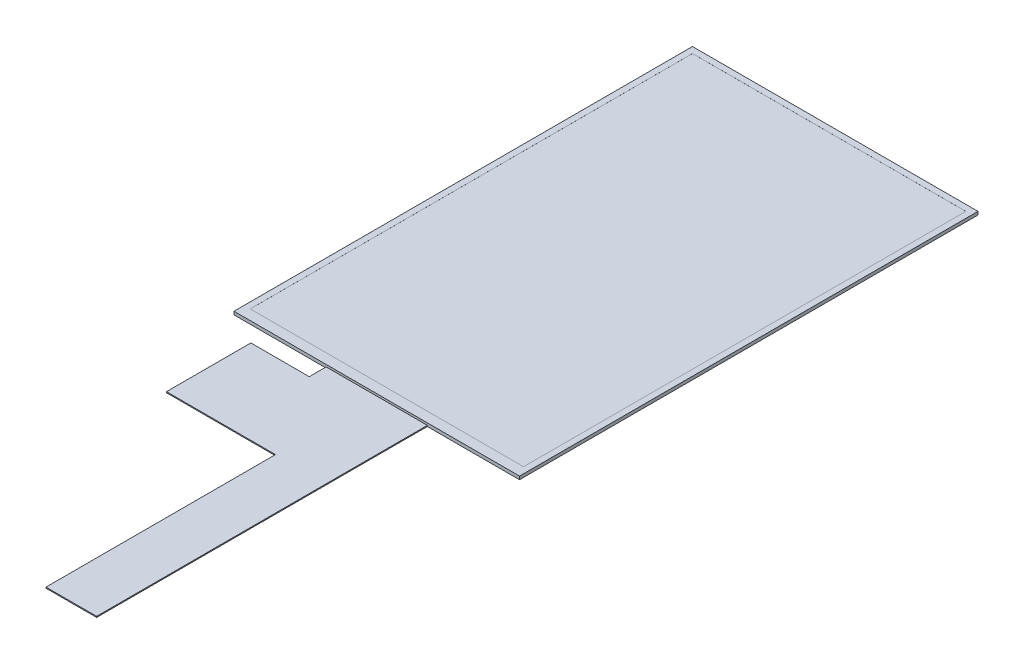
ISO-10303-21;
HEADER;
FILE_DESCRIPTION(('STEP AP214'),'2;1');
FILE_NAME('part.step','',(''),(''),'','','');
FILE_SCHEMA(('AUTOMOTIVE_DESIGN { 1 0 10303 214 1 1 1 1 }'));
ENDSEC;
DATA;
#1=APPLICATION_CONTEXT('core data for automotive mechanical design processes');
#2=APPLICATION_PROTOCOL_DEFINITION('international standard','automotive_design',2000,#1);
#3=PRODUCT_CONTEXT('',#1,'mechanical');
#4=PRODUCT('Part','Part','',(#3));
#5=PRODUCT_RELATED_PRODUCT_CATEGORY('part','',(#4));
#6=PRODUCT_DEFINITION_FORMATION('','',#4);
#7=PRODUCT_DEFINITION_CONTEXT('part definition',#1,'design');
#8=PRODUCT_DEFINITION('design','',#6,#7);
#9=PRODUCT_DEFINITION_SHAPE('','',#8);
#10=(LENGTH_UNIT() NAMED_UNIT(*) SI_UNIT(.MILLI.,.METRE.));
#11=(NAMED_UNIT(*) PLANE_ANGLE_UNIT() SI_UNIT($,.RADIAN.));
#12=(NAMED_UNIT(*) SI_UNIT($,.STERADIAN.) SOLID_ANGLE_UNIT());
#13=UNCERTAINTY_MEASURE_WITH_UNIT(LENGTH_MEASURE(1.E-05),#10,'distance_accuracy_value','');
#14=(GEOMETRIC_REPRESENTATION_CONTEXT(3) GLOBAL_UNCERTAINTY_ASSIGNED_CONTEXT((#13)) GLOBAL_UNIT_ASSIGNED_CONTEXT((#10,
#11,#12)) REPRESENTATION_CONTEXT('',''));
#15=CARTESIAN_POINT('',(0.,0.,0.));
#16=DIRECTION('',(0.,0.,1.));
#17=DIRECTION('',(1.,0.,0.));
#18=AXIS2_PLACEMENT_3D('',#15,#16,#17);
#19=CARTESIAN_POINT('',(-42.3000000000007,0.946,0.));
#20=DIRECTION('',(1.,0.,0.));
#21=DIRECTION('',(0.,0.,-1.));
#22=AXIS2_PLACEMENT_3D('',#19,#20,#21);
#23=PLANE('',#22);
#24=DIRECTION('',(0.,0.,1.));
#25=VECTOR('',#24,1.);
#26=CARTESIAN_POINT('',(-42.3000000000007,0.,0.));
#27=LINE('',#26,#25);
#28=CARTESIAN_POINT('',(-42.3000000000007,0.,-135.85));
#29=VERTEX_POINT('',#28);
#30=CARTESIAN_POINT('',(-42.3000000000007,0.,0.));
#31=VERTEX_POINT('',#30);
#32=EDGE_CURVE('E298',#29,#31,#27,.T.);
#33=ORIENTED_EDGE('',*,*,#32,.T.);
#34=DIRECTION('',(0.,-1.,0.));
#35=VECTOR('',#34,1.);
#36=CARTESIAN_POINT('',(-42.3000000000007,0.946,0.));
#37=LINE('',#36,#35);
#38=CARTESIAN_POINT('',(-42.3000000000007,0.946,0.));
#39=VERTEX_POINT('',#38);
#40=EDGE_CURVE('E11',#39,#31,#37,.T.);
#41=ORIENTED_EDGE('',*,*,#40,.F.);
#42=DIRECTION('',(0.,0.,1.));
#43=VECTOR('',#42,1.);
#44=CARTESIAN_POINT('',(-42.3000000000007,0.946,0.));
#45=LINE('',#44,#43);
#46=CARTESIAN_POINT('',(-42.3000000000007,0.946,-135.85));
#47=VERTEX_POINT('',#46);
#48=EDGE_CURVE('E299',#47,#39,#45,.T.);
#49=ORIENTED_EDGE('',*,*,#48,.F.);
#50=DIRECTION('',(0.,-1.,0.));
#51=VECTOR('',#50,1.);
#52=CARTESIAN_POINT('',(-42.3000000000007,0.946,-135.85));
#53=LINE('',#52,#51);
#54=EDGE_CURVE('E309',#47,#29,#53,.T.);
#55=ORIENTED_EDGE('',*,*,#54,.T.);
#56=EDGE_LOOP('',(#33,#41,#49,#55));
#57=FACE_BOUND('',#56,.T.);
#58=ADVANCED_FACE('F36',(#57),#23,.F.);
#59=CARTESIAN_POINT('',(-42.3000000000007,0.946,0.));
#60=DIRECTION('',(0.,0.,-1.));
#61=DIRECTION('',(-1.,0.,0.));
#62=AXIS2_PLACEMENT_3D('',#59,#60,#61);
#63=PLANE('',#62);
#64=DIRECTION('',(0.,-1.,0.));
#65=VECTOR('',#64,1.);
#66=CARTESIAN_POINT('',(-15.,0.31,0.));
#67=LINE('',#66,#65);
#68=CARTESIAN_POINT('',(-15.,0.31,0.));
#69=VERTEX_POINT('',#68);
#70=CARTESIAN_POINT('',(-15.,0.01,0.));
#71=VERTEX_POINT('',#70);
#72=EDGE_CURVE('E295',#69,#71,#67,.T.);
#73=ORIENTED_EDGE('',*,*,#72,.F.);
#74=DIRECTION('',(-1.,0.,0.));
#75=VECTOR('',#74,1.);
#76=CARTESIAN_POINT('',(15.,0.31,0.));
#77=LINE('',#76,#75);
#78=CARTESIAN_POINT('',(15.,0.31,0.));
#79=VERTEX_POINT('',#78);
#80=EDGE_CURVE('E241',#79,#69,#77,.T.);
#81=ORIENTED_EDGE('',*,*,#80,.F.);
#82=DIRECTION('',(0.,-1.,0.));
#83=VECTOR('',#82,1.);
#84=CARTESIAN_POINT('',(15.,0.31,0.));
#85=LINE('',#84,#83);
#86=CARTESIAN_POINT('',(15.,0.01,0.));
#87=VERTEX_POINT('',#86);
#88=EDGE_CURVE('E260',#79,#87,#85,.T.);
#89=ORIENTED_EDGE('',*,*,#88,.T.);
#90=DIRECTION('',(-1.,0.,0.));
#91=VECTOR('',#90,1.);
#92=CARTESIAN_POINT('',(15.,0.01,0.));
#93=LINE('',#92,#91);
#94=EDGE_CURVE('E235',#87,#71,#93,.T.);
#95=ORIENTED_EDGE('',*,*,#94,.T.);
#96=EDGE_LOOP('',(#73,#81,#89,#95));
#97=FACE_BOUND('',#96,.T.);
#98=DIRECTION('',(1.,0.,0.));
#99=VECTOR('',#98,1.);
#100=CARTESIAN_POINT('',(-42.3000000000007,0.,0.));
#101=LINE('',#100,#99);
#102=CARTESIAN_POINT('',(42.3000000000007,0.,0.));
#103=VERTEX_POINT('',#102);
#104=EDGE_CURVE('E312',#31,#103,#101,.T.);
#105=ORIENTED_EDGE('',*,*,#104,.T.);
#106=DIRECTION('',(0.,-1.,0.));
#107=VECTOR('',#106,1.);
#108=CARTESIAN_POINT('',(42.3000000000007,0.946,0.));
#109=LINE('',#108,#107);
#110=CARTESIAN_POINT('',(42.3000000000007,0.946,0.));
#111=VERTEX_POINT('',#110);
#112=EDGE_CURVE('E43',#111,#103,#109,.T.);
#113=ORIENTED_EDGE('',*,*,#112,.F.);
#114=DIRECTION('',(1.,0.,0.));
#115=VECTOR('',#114,1.);
#116=CARTESIAN_POINT('',(-42.3000000000007,0.946,0.));
#117=LINE('',#116,#115);
#118=EDGE_CURVE('E302',#39,#111,#117,.T.);
#119=ORIENTED_EDGE('',*,*,#118,.F.);
#120=ORIENTED_EDGE('',*,*,#40,.T.);
#121=EDGE_LOOP('',(#105,#113,#119,#120));
#122=FACE_BOUND('',#121,.T.);
#123=ADVANCED_FACE('F342',(#97,#122),#63,.F.);
#124=CARTESIAN_POINT('',(42.3000000000007,0.946,0.));
#125=DIRECTION('',(-1.,0.,0.));
#126=DIRECTION('',(0.,0.,1.));
#127=AXIS2_PLACEMENT_3D('',#124,#125,#126);
#128=PLANE('',#127);
#129=DIRECTION('',(0.,0.,-1.));
#130=VECTOR('',#129,1.);
#131=CARTESIAN_POINT('',(42.3000000000007,0.,0.));
#132=LINE('',#131,#130);
#133=CARTESIAN_POINT('',(42.2999999999993,0.,-135.85));
#134=VERTEX_POINT('',#133);
#135=EDGE_CURVE('E314',#103,#134,#132,.T.);
#136=ORIENTED_EDGE('',*,*,#135,.T.);
#137=DIRECTION('',(0.,-1.,0.));
#138=VECTOR('',#137,1.);
#139=CARTESIAN_POINT('',(42.2999999999993,0.946,-135.85));
#140=LINE('',#139,#138);
#141=CARTESIAN_POINT('',(42.2999999999993,0.946,-135.85));
#142=VERTEX_POINT('',#141);
#143=EDGE_CURVE('E319',#142,#134,#140,.T.);
#144=ORIENTED_EDGE('',*,*,#143,.F.);
#145=DIRECTION('',(0.,0.,-1.));
#146=VECTOR('',#145,1.);
#147=CARTESIAN_POINT('',(42.3000000000007,0.946,0.));
#148=LINE('',#147,#146);
#149=EDGE_CURVE('E305',#111,#142,#148,.T.);
#150=ORIENTED_EDGE('',*,*,#149,.F.);
#151=ORIENTED_EDGE('',*,*,#112,.T.);
#152=EDGE_LOOP('',(#136,#144,#150,#151));
#153=FACE_BOUND('',#152,.T.);
#154=ADVANCED_FACE('F326',(#153),#128,.F.);
#155=CARTESIAN_POINT('',(-42.3000000000007,0.946,-135.85));
#156=DIRECTION('',(0.,0.,1.));
#157=DIRECTION('',(1.,0.,0.));
#158=AXIS2_PLACEMENT_3D('',#155,#156,#157);
#159=PLANE('',#158);
#160=DIRECTION('',(-1.,0.,0.));
#161=VECTOR('',#160,1.);
#162=CARTESIAN_POINT('',(-42.3000000000007,0.,-135.85));
#163=LINE('',#162,#161);
#164=EDGE_CURVE('E303',#134,#29,#163,.T.);
#165=ORIENTED_EDGE('',*,*,#164,.T.);
#166=ORIENTED_EDGE('',*,*,#54,.F.);
#167=DIRECTION('',(-1.,0.,0.));
#168=VECTOR('',#167,1.);
#169=CARTESIAN_POINT('',(-42.3000000000007,0.946,-135.85));
#170=LINE('',#169,#168);
#171=EDGE_CURVE('E307',#142,#47,#170,.T.);
#172=ORIENTED_EDGE('',*,*,#171,.F.);
#173=ORIENTED_EDGE('',*,*,#143,.T.);
#174=EDGE_LOOP('',(#165,#166,#172,#173));
#175=FACE_BOUND('',#174,.T.);
#176=ADVANCED_FACE('F335',(#175),#159,.F.);
#177=CARTESIAN_POINT('',(0.,0.946,0.));
#178=DIRECTION('',(0.,-1.,0.));
#179=DIRECTION('',(0.,0.,-1.));
#180=AXIS2_PLACEMENT_3D('',#177,#178,#179);
#181=PLANE('',#180);
#182=DIRECTION('',(1.,0.,0.));
#183=VECTOR('',#182,1.);
#184=CARTESIAN_POINT('',(-40.5000000000007,0.946,-3.));
#185=LINE('',#184,#183);
#186=CARTESIAN_POINT('',(-40.5000000000007,0.946,-3.));
#187=VERTEX_POINT('',#186);
#188=CARTESIAN_POINT('',(40.5000000000007,0.946,-3.));
#189=VERTEX_POINT('',#188);
#190=EDGE_CURVE('E225',#187,#189,#185,.T.);
#191=ORIENTED_EDGE('',*,*,#190,.F.);
#192=DIRECTION('',(0.,0.,1.));
#193=VECTOR('',#192,1.);
#194=CARTESIAN_POINT('',(-40.5000000000007,0.946,-134.05));
#195=LINE('',#194,#193);
#196=CARTESIAN_POINT('',(-40.5000000000007,0.946,-134.05));
#197=VERTEX_POINT('',#196);
#198=EDGE_CURVE('E58',#197,#187,#195,.T.);
#199=ORIENTED_EDGE('',*,*,#198,.F.);
#200=DIRECTION('',(-1.,0.,0.));
#201=VECTOR('',#200,1.);
#202=CARTESIAN_POINT('',(-40.5000000000007,0.946,-134.05));
#203=LINE('',#202,#201);
#204=CARTESIAN_POINT('',(40.5000000000007,0.946,-134.05));
#205=VERTEX_POINT('',#204);
#206=EDGE_CURVE('E214',#205,#197,#203,.T.);
#207=ORIENTED_EDGE('',*,*,#206,.F.);
#208=DIRECTION('',(0.,0.,-1.));
#209=VECTOR('',#208,1.);
#210=CARTESIAN_POINT('',(40.5000000000007,0.946,-134.05));
#211=LINE('',#210,#209);
#212=EDGE_CURVE('E228',#189,#205,#211,.T.);
#213=ORIENTED_EDGE('',*,*,#212,.F.);
#214=EDGE_LOOP('',(#191,#199,#207,#213));
#215=FACE_BOUND('',#214,.T.);
#216=ORIENTED_EDGE('',*,*,#48,.T.);
#217=ORIENTED_EDGE('',*,*,#118,.T.);
#218=ORIENTED_EDGE('',*,*,#149,.T.);
#219=ORIENTED_EDGE('',*,*,#171,.T.);
#220=EDGE_LOOP('',(#216,#217,#218,#219));
#221=FACE_BOUND('',#220,.T.);
#222=ADVANCED_FACE('F341',(#215,#221),#181,.F.);
#223=CARTESIAN_POINT('',(0.,0.,0.));
#224=DIRECTION('',(0.,-1.,0.));
#225=DIRECTION('',(0.,0.,-1.));
#226=AXIS2_PLACEMENT_3D('',#223,#224,#225);
#227=PLANE('',#226);
#228=DIRECTION('',(0.,0.,1.));
#229=VECTOR('',#228,1.);
#230=CARTESIAN_POINT('',(40.5000000000007,0.,0.));
#231=LINE('',#230,#229);
#232=CARTESIAN_POINT('',(40.5000000000007,0.,-134.05));
#233=VERTEX_POINT('',#232);
#234=CARTESIAN_POINT('',(40.5000000000007,0.,-3.));
#235=VERTEX_POINT('',#234);
#236=EDGE_CURVE('E50',#233,#235,#231,.T.);
#237=ORIENTED_EDGE('',*,*,#236,.F.);
#238=DIRECTION('',(1.,0.,0.));
#239=VECTOR('',#238,1.);
#240=CARTESIAN_POINT('',(0.,0.,-134.05));
#241=LINE('',#240,#239);
#242=CARTESIAN_POINT('',(-40.5000000000007,0.,-134.05));
#243=VERTEX_POINT('',#242);
#244=EDGE_CURVE('E192',#243,#233,#241,.T.);
#245=ORIENTED_EDGE('',*,*,#244,.F.);
#246=DIRECTION('',(0.,0.,-1.));
#247=VECTOR('',#246,1.);
#248=CARTESIAN_POINT('',(-40.5000000000007,0.,0.));
#249=LINE('',#248,#247);
#250=CARTESIAN_POINT('',(-40.5000000000007,0.,-3.));
#251=VERTEX_POINT('',#250);
#252=EDGE_CURVE('E195',#251,#243,#249,.T.);
#253=ORIENTED_EDGE('',*,*,#252,.F.);
#254=DIRECTION('',(-1.,0.,0.));
#255=VECTOR('',#254,1.);
#256=CARTESIAN_POINT('',(0.,0.,-3.));
#257=LINE('',#256,#255);
#258=EDGE_CURVE('E201',#235,#251,#257,.T.);
#259=ORIENTED_EDGE('',*,*,#258,.F.);
#260=EDGE_LOOP('',(#237,#245,#253,#259));
#261=FACE_BOUND('',#260,.T.);
#262=ORIENTED_EDGE('',*,*,#32,.F.);
#263=ORIENTED_EDGE('',*,*,#164,.F.);
#264=ORIENTED_EDGE('',*,*,#135,.F.);
#265=ORIENTED_EDGE('',*,*,#104,.F.);
#266=EDGE_LOOP('',(#262,#263,#264,#265));
#267=FACE_BOUND('',#266,.T.);
#268=ADVANCED_FACE('F332',(#261,#267),#227,.T.);
#269=CARTESIAN_POINT('',(-15.,0.31,0.));
#270=DIRECTION('',(1.,0.,0.));
#271=DIRECTION('',(0.,0.,-1.));
#272=AXIS2_PLACEMENT_3D('',#269,#270,#271);
#273=PLANE('',#272);
#274=DIRECTION('',(0.,0.,1.));
#275=VECTOR('',#274,1.);
#276=CARTESIAN_POINT('',(-15.,0.01,0.));
#277=LINE('',#276,#275);
#278=CARTESIAN_POINT('',(-15.,0.01,5.));
#279=VERTEX_POINT('',#278);
#280=EDGE_CURVE('E262',#71,#279,#277,.T.);
#281=ORIENTED_EDGE('',*,*,#280,.T.);
#282=DIRECTION('',(0.,-1.,0.));
#283=VECTOR('',#282,1.);
#284=CARTESIAN_POINT('',(-15.,0.31,5.));
#285=LINE('',#284,#283);
#286=CARTESIAN_POINT('',(-15.,0.31,5.));
#287=VERTEX_POINT('',#286);
#288=EDGE_CURVE('E292',#287,#279,#285,.T.);
#289=ORIENTED_EDGE('',*,*,#288,.F.);
#290=DIRECTION('',(0.,0.,1.));
#291=VECTOR('',#290,1.);
#292=CARTESIAN_POINT('',(-15.,0.31,0.));
#293=LINE('',#292,#291);
#294=EDGE_CURVE('E244',#69,#287,#293,.T.);
#295=ORIENTED_EDGE('',*,*,#294,.F.);
#296=ORIENTED_EDGE('',*,*,#72,.T.);
#297=EDGE_LOOP('',(#281,#289,#295,#296));
#298=FACE_BOUND('',#297,.T.);
#299=ADVANCED_FACE('F355',(#298),#273,.F.);
#300=CARTESIAN_POINT('',(-15.,0.31,5.));
#301=DIRECTION('',(0.,0.,1.));
#302=DIRECTION('',(1.,0.,0.));
#303=AXIS2_PLACEMENT_3D('',#300,#301,#302);
#304=PLANE('',#303);
#305=DIRECTION('',(-1.,0.,0.));
#306=VECTOR('',#305,1.);
#307=CARTESIAN_POINT('',(-15.,0.01,5.));
#308=LINE('',#307,#306);
#309=CARTESIAN_POINT('',(-32.3000000000007,0.01,5.));
#310=VERTEX_POINT('',#309);
#311=EDGE_CURVE('E264',#279,#310,#308,.T.);
#312=ORIENTED_EDGE('',*,*,#311,.T.);
#313=DIRECTION('',(0.,-1.,0.));
#314=VECTOR('',#313,1.);
#315=CARTESIAN_POINT('',(-32.3000000000007,0.31,5.));
#316=LINE('',#315,#314);
#317=CARTESIAN_POINT('',(-32.3000000000007,0.31,5.));
#318=VERTEX_POINT('',#317);
#319=EDGE_CURVE('E289',#318,#310,#316,.T.);
#320=ORIENTED_EDGE('',*,*,#319,.F.);
#321=DIRECTION('',(-1.,0.,0.));
#322=VECTOR('',#321,1.);
#323=CARTESIAN_POINT('',(-15.,0.31,5.));
#324=LINE('',#323,#322);
#325=EDGE_CURVE('E247',#287,#318,#324,.T.);
#326=ORIENTED_EDGE('',*,*,#325,.F.);
#327=ORIENTED_EDGE('',*,*,#288,.T.);
#328=EDGE_LOOP('',(#312,#320,#326,#327));
#329=FACE_BOUND('',#328,.T.);
#330=ADVANCED_FACE('F362',(#329),#304,.F.);
#331=CARTESIAN_POINT('',(-32.3000000000007,0.31,5.));
#332=DIRECTION('',(1.,0.,0.));
#333=DIRECTION('',(0.,0.,-1.));
#334=AXIS2_PLACEMENT_3D('',#331,#332,#333);
#335=PLANE('',#334);
#336=DIRECTION('',(0.,0.,1.));
#337=VECTOR('',#336,1.);
#338=CARTESIAN_POINT('',(-32.3000000000007,0.01,5.));
#339=LINE('',#338,#337);
#340=CARTESIAN_POINT('',(-32.3000000000007,0.01,30.));
#341=VERTEX_POINT('',#340);
#342=EDGE_CURVE('E266',#310,#341,#339,.T.);
#343=ORIENTED_EDGE('',*,*,#342,.T.);
#344=DIRECTION('',(0.,-1.,0.));
#345=VECTOR('',#344,1.);
#346=CARTESIAN_POINT('',(-32.3000000000007,0.31,30.));
#347=LINE('',#346,#345);
#348=CARTESIAN_POINT('',(-32.3000000000007,0.31,30.));
#349=VERTEX_POINT('',#348);
#350=EDGE_CURVE('E286',#349,#341,#347,.T.);
#351=ORIENTED_EDGE('',*,*,#350,.F.);
#352=DIRECTION('',(0.,0.,1.));
#353=VECTOR('',#352,1.);
#354=CARTESIAN_POINT('',(-32.3000000000007,0.31,5.));
#355=LINE('',#354,#353);
#356=EDGE_CURVE('E249',#318,#349,#355,.T.);
#357=ORIENTED_EDGE('',*,*,#356,.F.);
#358=ORIENTED_EDGE('',*,*,#319,.T.);
#359=EDGE_LOOP('',(#343,#351,#357,#358));
#360=FACE_BOUND('',#359,.T.);
#361=ADVANCED_FACE('F366',(#360),#335,.F.);
#362=CARTESIAN_POINT('',(-32.3000000000007,0.31,30.));
#363=DIRECTION('',(0.,0.,-1.));
#364=DIRECTION('',(-1.,0.,0.));
#365=AXIS2_PLACEMENT_3D('',#362,#363,#364);
#366=PLANE('',#365);
#367=DIRECTION('',(1.,0.,0.));
#368=VECTOR('',#367,1.);
#369=CARTESIAN_POINT('',(-32.3000000000007,0.01,30.));
#370=LINE('',#369,#368);
#371=CARTESIAN_POINT('',(0.,0.01,30.));
#372=VERTEX_POINT('',#371);
#373=EDGE_CURVE('E268',#341,#372,#370,.T.);
#374=ORIENTED_EDGE('',*,*,#373,.T.);
#375=DIRECTION('',(0.,-1.,0.));
#376=VECTOR('',#375,1.);
#377=CARTESIAN_POINT('',(0.,0.31,30.));
#378=LINE('',#377,#376);
#379=CARTESIAN_POINT('',(0.,0.31,30.));
#380=VERTEX_POINT('',#379);
#381=EDGE_CURVE('E283',#380,#372,#378,.T.);
#382=ORIENTED_EDGE('',*,*,#381,.F.);
#383=DIRECTION('',(1.,0.,0.));
#384=VECTOR('',#383,1.);
#385=CARTESIAN_POINT('',(-32.3000000000007,0.31,30.));
#386=LINE('',#385,#384);
#387=EDGE_CURVE('E251',#349,#380,#386,.T.);
#388=ORIENTED_EDGE('',*,*,#387,.F.);
#389=ORIENTED_EDGE('',*,*,#350,.T.);
#390=EDGE_LOOP('',(#374,#382,#388,#389));
#391=FACE_BOUND('',#390,.T.);
#392=ADVANCED_FACE('F370',(#391),#366,.F.);
#393=CARTESIAN_POINT('',(0.,0.31,30.));
#394=DIRECTION('',(1.,0.,0.));
#395=DIRECTION('',(0.,0.,-1.));
#396=AXIS2_PLACEMENT_3D('',#393,#394,#395);
#397=PLANE('',#396);
#398=DIRECTION('',(0.,0.,1.));
#399=VECTOR('',#398,1.);
#400=CARTESIAN_POINT('',(0.,0.01,30.));
#401=LINE('',#400,#399);
#402=CARTESIAN_POINT('',(0.,0.01,98.));
#403=VERTEX_POINT('',#402);
#404=EDGE_CURVE('E270',#372,#403,#401,.T.);
#405=ORIENTED_EDGE('',*,*,#404,.T.);
#406=DIRECTION('',(0.,-1.,0.));
#407=VECTOR('',#406,1.);
#408=CARTESIAN_POINT('',(0.,0.31,98.));
#409=LINE('',#408,#407);
#410=CARTESIAN_POINT('',(0.,0.31,98.));
#411=VERTEX_POINT('',#410);
#412=EDGE_CURVE('E280',#411,#403,#409,.T.);
#413=ORIENTED_EDGE('',*,*,#412,.F.);
#414=DIRECTION('',(0.,0.,1.));
#415=VECTOR('',#414,1.);
#416=CARTESIAN_POINT('',(0.,0.31,30.));
#417=LINE('',#416,#415);
#418=EDGE_CURVE('E253',#380,#411,#417,.T.);
#419=ORIENTED_EDGE('',*,*,#418,.F.);
#420=ORIENTED_EDGE('',*,*,#381,.T.);
#421=EDGE_LOOP('',(#405,#413,#419,#420));
#422=FACE_BOUND('',#421,.T.);
#423=ADVANCED_FACE('F374',(#422),#397,.F.);
#424=CARTESIAN_POINT('',(0.,0.31,98.));
#425=DIRECTION('',(0.,0.,-1.));
#426=DIRECTION('',(-1.,0.,0.));
#427=AXIS2_PLACEMENT_3D('',#424,#425,#426);
#428=PLANE('',#427);
#429=DIRECTION('',(1.,0.,0.));
#430=VECTOR('',#429,1.);
#431=CARTESIAN_POINT('',(0.,0.01,98.));
#432=LINE('',#431,#430);
#433=CARTESIAN_POINT('',(15.,0.01,98.));
#434=VERTEX_POINT('',#433);
#435=EDGE_CURVE('E272',#403,#434,#432,.T.);
#436=ORIENTED_EDGE('',*,*,#435,.T.);
#437=DIRECTION('',(0.,-1.,0.));
#438=VECTOR('',#437,1.);
#439=CARTESIAN_POINT('',(15.,0.31,98.));
#440=LINE('',#439,#438);
#441=CARTESIAN_POINT('',(15.,0.31,98.));
#442=VERTEX_POINT('',#441);
#443=EDGE_CURVE('E277',#442,#434,#440,.T.);
#444=ORIENTED_EDGE('',*,*,#443,.F.);
#445=DIRECTION('',(1.,0.,0.));
#446=VECTOR('',#445,1.);
#447=CARTESIAN_POINT('',(0.,0.31,98.));
#448=LINE('',#447,#446);
#449=EDGE_CURVE('E255',#411,#442,#448,.T.);
#450=ORIENTED_EDGE('',*,*,#449,.F.);
#451=ORIENTED_EDGE('',*,*,#412,.T.);
#452=EDGE_LOOP('',(#436,#444,#450,#451));
#453=FACE_BOUND('',#452,.T.);
#454=ADVANCED_FACE('F378',(#453),#428,.F.);
#455=CARTESIAN_POINT('',(15.,0.31,98.));
#456=DIRECTION('',(-1.,0.,0.));
#457=DIRECTION('',(0.,0.,1.));
#458=AXIS2_PLACEMENT_3D('',#455,#456,#457);
#459=PLANE('',#458);
#460=DIRECTION('',(0.,0.,-1.));
#461=VECTOR('',#460,1.);
#462=CARTESIAN_POINT('',(15.,0.01,98.));
#463=LINE('',#462,#461);
#464=EDGE_CURVE('E245',#434,#87,#463,.T.);
#465=ORIENTED_EDGE('',*,*,#464,.T.);
#466=ORIENTED_EDGE('',*,*,#88,.F.);
#467=DIRECTION('',(0.,0.,-1.));
#468=VECTOR('',#467,1.);
#469=CARTESIAN_POINT('',(15.,0.31,98.));
#470=LINE('',#469,#468);
#471=EDGE_CURVE('E257',#442,#79,#470,.T.);
#472=ORIENTED_EDGE('',*,*,#471,.F.);
#473=ORIENTED_EDGE('',*,*,#443,.T.);
#474=EDGE_LOOP('',(#465,#466,#472,#473));
#475=FACE_BOUND('',#474,.T.);
#476=ADVANCED_FACE('F382',(#475),#459,.F.);
#477=CARTESIAN_POINT('',(0.,0.31,0.));
#478=DIRECTION('',(0.,1.,0.));
#479=DIRECTION('',(0.,0.,1.));
#480=AXIS2_PLACEMENT_3D('',#477,#478,#479);
#481=PLANE('',#480);
#482=ORIENTED_EDGE('',*,*,#80,.T.);
#483=ORIENTED_EDGE('',*,*,#294,.T.);
#484=ORIENTED_EDGE('',*,*,#325,.T.);
#485=ORIENTED_EDGE('',*,*,#356,.T.);
#486=ORIENTED_EDGE('',*,*,#387,.T.);
#487=ORIENTED_EDGE('',*,*,#418,.T.);
#488=ORIENTED_EDGE('',*,*,#449,.T.);
#489=ORIENTED_EDGE('',*,*,#471,.T.);
#490=EDGE_LOOP('',(#482,#483,#484,#485,#486,#487,#488,#489));
#491=FACE_BOUND('',#490,.T.);
#492=ADVANCED_FACE('F386',(#491),#481,.T.);
#493=CARTESIAN_POINT('',(0.,0.01,0.));
#494=DIRECTION('',(0.,1.,0.));
#495=DIRECTION('',(0.,0.,1.));
#496=AXIS2_PLACEMENT_3D('',#493,#494,#495);
#497=PLANE('',#496);
#498=ORIENTED_EDGE('',*,*,#94,.F.);
#499=ORIENTED_EDGE('',*,*,#464,.F.);
#500=ORIENTED_EDGE('',*,*,#435,.F.);
#501=ORIENTED_EDGE('',*,*,#404,.F.);
#502=ORIENTED_EDGE('',*,*,#373,.F.);
#503=ORIENTED_EDGE('',*,*,#342,.F.);
#504=ORIENTED_EDGE('',*,*,#311,.F.);
#505=ORIENTED_EDGE('',*,*,#280,.F.);
#506=EDGE_LOOP('',(#498,#499,#500,#501,#502,#503,#504,#505));
#507=FACE_BOUND('',#506,.T.);
#508=ADVANCED_FACE('F388',(#507),#497,.F.);
#509=CARTESIAN_POINT('',(-40.5000000000007,0.936,-134.05));
#510=DIRECTION('',(-1.,0.,0.));
#511=DIRECTION('',(0.,0.,1.));
#512=AXIS2_PLACEMENT_3D('',#509,#510,#511);
#513=PLANE('',#512);
#514=ORIENTED_EDGE('',*,*,#198,.T.);
#515=DIRECTION('',(0.,1.,0.));
#516=VECTOR('',#515,1.);
#517=CARTESIAN_POINT('',(-40.5000000000007,0.936,-3.));
#518=LINE('',#517,#516);
#519=CARTESIAN_POINT('',(-40.5000000000007,0.936,-3.));
#520=VERTEX_POINT('',#519);
#521=EDGE_CURVE('E223',#520,#187,#518,.T.);
#522=ORIENTED_EDGE('',*,*,#521,.F.);
#523=DIRECTION('',(0.,0.,1.));
#524=VECTOR('',#523,1.);
#525=CARTESIAN_POINT('',(-40.5000000000007,0.936,-134.05));
#526=LINE('',#525,#524);
#527=CARTESIAN_POINT('',(-40.5000000000007,0.936,-134.05));
#528=VERTEX_POINT('',#527);
#529=EDGE_CURVE('E210',#528,#520,#526,.T.);
#530=ORIENTED_EDGE('',*,*,#529,.F.);
#531=DIRECTION('',(0.,1.,0.));
#532=VECTOR('',#531,1.);
#533=CARTESIAN_POINT('',(-40.5000000000007,0.936,-134.05));
#534=LINE('',#533,#532);
#535=EDGE_CURVE('E233',#528,#197,#534,.T.);
#536=ORIENTED_EDGE('',*,*,#535,.T.);
#537=EDGE_LOOP('',(#514,#522,#530,#536));
#538=FACE_BOUND('',#537,.T.);
#539=ADVANCED_FACE('F391',(#538),#513,.F.);
#540=CARTESIAN_POINT('',(-40.5000000000007,0.936,-134.05));
#541=DIRECTION('',(0.,0.,-1.));
#542=DIRECTION('',(-1.,0.,0.));
#543=AXIS2_PLACEMENT_3D('',#540,#541,#542);
#544=PLANE('',#543);
#545=ORIENTED_EDGE('',*,*,#206,.T.);
#546=ORIENTED_EDGE('',*,*,#535,.F.);
#547=DIRECTION('',(-1.,0.,0.));
#548=VECTOR('',#547,1.);
#549=CARTESIAN_POINT('',(-40.5000000000007,0.936,-134.05));
#550=LINE('',#549,#548);
#551=CARTESIAN_POINT('',(40.5000000000007,0.936,-134.05));
#552=VERTEX_POINT('',#551);
#553=EDGE_CURVE('E220',#552,#528,#550,.T.);
#554=ORIENTED_EDGE('',*,*,#553,.F.);
#555=DIRECTION('',(0.,1.,0.));
#556=VECTOR('',#555,1.);
#557=CARTESIAN_POINT('',(40.5000000000007,0.936,-134.05));
#558=LINE('',#557,#556);
#559=EDGE_CURVE('E236',#552,#205,#558,.T.);
#560=ORIENTED_EDGE('',*,*,#559,.T.);
#561=EDGE_LOOP('',(#545,#546,#554,#560));
#562=FACE_BOUND('',#561,.T.);
#563=ADVANCED_FACE('F398',(#562),#544,.F.);
#564=CARTESIAN_POINT('',(40.5000000000007,0.936,-134.05));
#565=DIRECTION('',(1.,0.,0.));
#566=DIRECTION('',(0.,0.,-1.));
#567=AXIS2_PLACEMENT_3D('',#564,#565,#566);
#568=PLANE('',#567);
#569=ORIENTED_EDGE('',*,*,#212,.T.);
#570=ORIENTED_EDGE('',*,*,#559,.F.);
#571=DIRECTION('',(0.,0.,-1.));
#572=VECTOR('',#571,1.);
#573=CARTESIAN_POINT('',(40.5000000000007,0.936,-134.05));
#574=LINE('',#573,#572);
#575=CARTESIAN_POINT('',(40.5000000000007,0.936,-3.));
#576=VERTEX_POINT('',#575);
#577=EDGE_CURVE('E217',#576,#552,#574,.T.);
#578=ORIENTED_EDGE('',*,*,#577,.F.);
#579=DIRECTION('',(0.,1.,0.));
#580=VECTOR('',#579,1.);
#581=CARTESIAN_POINT('',(40.5000000000007,0.936,-3.));
#582=LINE('',#581,#580);
#583=EDGE_CURVE('E238',#576,#189,#582,.T.);
#584=ORIENTED_EDGE('',*,*,#583,.T.);
#585=EDGE_LOOP('',(#569,#570,#578,#584));
#586=FACE_BOUND('',#585,.T.);
#587=ADVANCED_FACE('F403',(#586),#568,.F.);
#588=CARTESIAN_POINT('',(-40.5000000000007,0.936,-3.));
#589=DIRECTION('',(0.,0.,1.));
#590=DIRECTION('',(1.,0.,0.));
#591=AXIS2_PLACEMENT_3D('',#588,#589,#590);
#592=PLANE('',#591);
#593=ORIENTED_EDGE('',*,*,#190,.T.);
#594=ORIENTED_EDGE('',*,*,#583,.F.);
#595=DIRECTION('',(1.,0.,0.));
#596=VECTOR('',#595,1.);
#597=CARTESIAN_POINT('',(-40.5000000000007,0.936,-3.));
#598=LINE('',#597,#596);
#599=EDGE_CURVE('E213',#520,#576,#598,.T.);
#600=ORIENTED_EDGE('',*,*,#599,.F.);
#601=ORIENTED_EDGE('',*,*,#521,.T.);
#602=EDGE_LOOP('',(#593,#594,#600,#601));
#603=FACE_BOUND('',#602,.T.);
#604=ADVANCED_FACE('F399',(#603),#592,.F.);
#605=CARTESIAN_POINT('',(0.,0.936,0.));
#606=DIRECTION('',(0.,1.,0.));
#607=DIRECTION('',(0.,0.,1.));
#608=AXIS2_PLACEMENT_3D('',#605,#606,#607);
#609=PLANE('',#608);
#610=ORIENTED_EDGE('',*,*,#529,.T.);
#611=ORIENTED_EDGE('',*,*,#599,.T.);
#612=ORIENTED_EDGE('',*,*,#577,.T.);
#613=ORIENTED_EDGE('',*,*,#553,.T.);
#614=EDGE_LOOP('',(#610,#611,#612,#613));
#615=FACE_BOUND('',#614,.T.);
#616=ADVANCED_FACE('F402',(#615),#609,.T.);
#617=CARTESIAN_POINT('',(40.5000000000007,0.01,0.));
#618=DIRECTION('',(1.,0.,0.));
#619=DIRECTION('',(0.,0.,-1.));
#620=AXIS2_PLACEMENT_3D('',#617,#618,#619);
#621=PLANE('',#620);
#622=ORIENTED_EDGE('',*,*,#236,.T.);
#623=DIRECTION('',(0.,-1.,0.));
#624=VECTOR('',#623,1.);
#625=CARTESIAN_POINT('',(40.5000000000007,0.01,-3.));
#626=LINE('',#625,#624);
#627=CARTESIAN_POINT('',(40.5000000000007,0.01,-3.));
#628=VERTEX_POINT('',#627);
#629=EDGE_CURVE('E170',#628,#235,#626,.T.);
#630=ORIENTED_EDGE('',*,*,#629,.F.);
#631=DIRECTION('',(0.,0.,1.));
#632=VECTOR('',#631,1.);
#633=CARTESIAN_POINT('',(40.5000000000007,0.01,0.));
#634=LINE('',#633,#632);
#635=CARTESIAN_POINT('',(40.5000000000007,0.01,-134.05));
#636=VERTEX_POINT('',#635);
#637=EDGE_CURVE('E174',#636,#628,#634,.T.);
#638=ORIENTED_EDGE('',*,*,#637,.F.);
#639=DIRECTION('',(0.,-1.,0.));
#640=VECTOR('',#639,1.);
#641=CARTESIAN_POINT('',(40.5000000000007,0.01,-134.05));
#642=LINE('',#641,#640);
#643=EDGE_CURVE('E205',#636,#233,#642,.T.);
#644=ORIENTED_EDGE('',*,*,#643,.T.);
#645=EDGE_LOOP('',(#622,#630,#638,#644));
#646=FACE_BOUND('',#645,.T.);
#647=ADVANCED_FACE('F172',(#646),#621,.F.);
#648=CARTESIAN_POINT('',(0.,0.01,-134.05));
#649=DIRECTION('',(0.,0.,-1.));
#650=DIRECTION('',(-1.,0.,0.));
#651=AXIS2_PLACEMENT_3D('',#648,#649,#650);
#652=PLANE('',#651);
#653=ORIENTED_EDGE('',*,*,#244,.T.);
#654=ORIENTED_EDGE('',*,*,#643,.F.);
#655=DIRECTION('',(1.,0.,0.));
#656=VECTOR('',#655,1.);
#657=CARTESIAN_POINT('',(0.,0.01,-134.05));
#658=LINE('',#657,#656);
#659=CARTESIAN_POINT('',(-40.5000000000007,0.01,-134.05));
#660=VERTEX_POINT('',#659);
#661=EDGE_CURVE('E180',#660,#636,#658,.T.);
#662=ORIENTED_EDGE('',*,*,#661,.F.);
#663=DIRECTION('',(0.,-1.,0.));
#664=VECTOR('',#663,1.);
#665=CARTESIAN_POINT('',(-40.5000000000007,0.01,-134.05));
#666=LINE('',#665,#664);
#667=EDGE_CURVE('E207',#660,#243,#666,.T.);
#668=ORIENTED_EDGE('',*,*,#667,.T.);
#669=EDGE_LOOP('',(#653,#654,#662,#668));
#670=FACE_BOUND('',#669,.T.);
#671=ADVANCED_FACE('F416',(#670),#652,.F.);
#672=CARTESIAN_POINT('',(-40.5000000000007,0.01,0.));
#673=DIRECTION('',(-1.,0.,0.));
#674=DIRECTION('',(0.,0.,1.));
#675=AXIS2_PLACEMENT_3D('',#672,#673,#674);
#676=PLANE('',#675);
#677=ORIENTED_EDGE('',*,*,#252,.T.);
#678=ORIENTED_EDGE('',*,*,#667,.F.);
#679=DIRECTION('',(0.,0.,-1.));
#680=VECTOR('',#679,1.);
#681=CARTESIAN_POINT('',(-40.5000000000007,0.01,0.));
#682=LINE('',#681,#680);
#683=CARTESIAN_POINT('',(-40.5000000000007,0.01,-3.));
#684=VERTEX_POINT('',#683);
#685=EDGE_CURVE('E188',#684,#660,#682,.T.);
#686=ORIENTED_EDGE('',*,*,#685,.F.);
#687=DIRECTION('',(0.,-1.,0.));
#688=VECTOR('',#687,1.);
#689=CARTESIAN_POINT('',(-40.5000000000007,0.01,-3.));
#690=LINE('',#689,#688);
#691=EDGE_CURVE('E179',#684,#251,#690,.T.);
#692=ORIENTED_EDGE('',*,*,#691,.T.);
#693=EDGE_LOOP('',(#677,#678,#686,#692));
#694=FACE_BOUND('',#693,.T.);
#695=ADVANCED_FACE('F419',(#694),#676,.F.);
#696=CARTESIAN_POINT('',(0.,0.01,-3.));
#697=DIRECTION('',(0.,0.,1.));
#698=DIRECTION('',(1.,0.,0.));
#699=AXIS2_PLACEMENT_3D('',#696,#697,#698);
#700=PLANE('',#699);
#701=ORIENTED_EDGE('',*,*,#258,.T.);
#702=ORIENTED_EDGE('',*,*,#691,.F.);
#703=DIRECTION('',(-1.,0.,0.));
#704=VECTOR('',#703,1.);
#705=CARTESIAN_POINT('',(0.,0.01,-3.));
#706=LINE('',#705,#704);
#707=EDGE_CURVE('E183',#628,#684,#706,.T.);
#708=ORIENTED_EDGE('',*,*,#707,.F.);
#709=ORIENTED_EDGE('',*,*,#629,.T.);
#710=EDGE_LOOP('',(#701,#702,#708,#709));
#711=FACE_BOUND('',#710,.T.);
#712=ADVANCED_FACE('F184',(#711),#700,.F.);
#713=CARTESIAN_POINT('',(0.,0.01,0.));
#714=DIRECTION('',(0.,-1.,0.));
#715=DIRECTION('',(0.,0.,-1.));
#716=AXIS2_PLACEMENT_3D('',#713,#714,#715);
#717=PLANE('',#716);
#718=ORIENTED_EDGE('',*,*,#637,.T.);
#719=ORIENTED_EDGE('',*,*,#707,.T.);
#720=ORIENTED_EDGE('',*,*,#685,.T.);
#721=ORIENTED_EDGE('',*,*,#661,.T.);
#722=EDGE_LOOP('',(#718,#719,#720,#721));
#723=FACE_BOUND('',#722,.T.);
#724=ADVANCED_FACE('F190',(#723),#717,.T.);
#725=CLOSED_SHELL('',(#58,#123,#154,#176,#222,#268,#299,#330,#361,#392,#423,#454,#476,#492,#508,
#539,#563,#587,#604,#616,#647,#671,#695,#712,#724));
#726=MANIFOLD_SOLID_BREP('B2',#725);
#727=ADVANCED_BREP_SHAPE_REPRESENTATION('',(#18,#726),#14);
#728=SHAPE_DEFINITION_REPRESENTATION(#9,#727);
ENDSEC;
END-ISO-10303-21;
